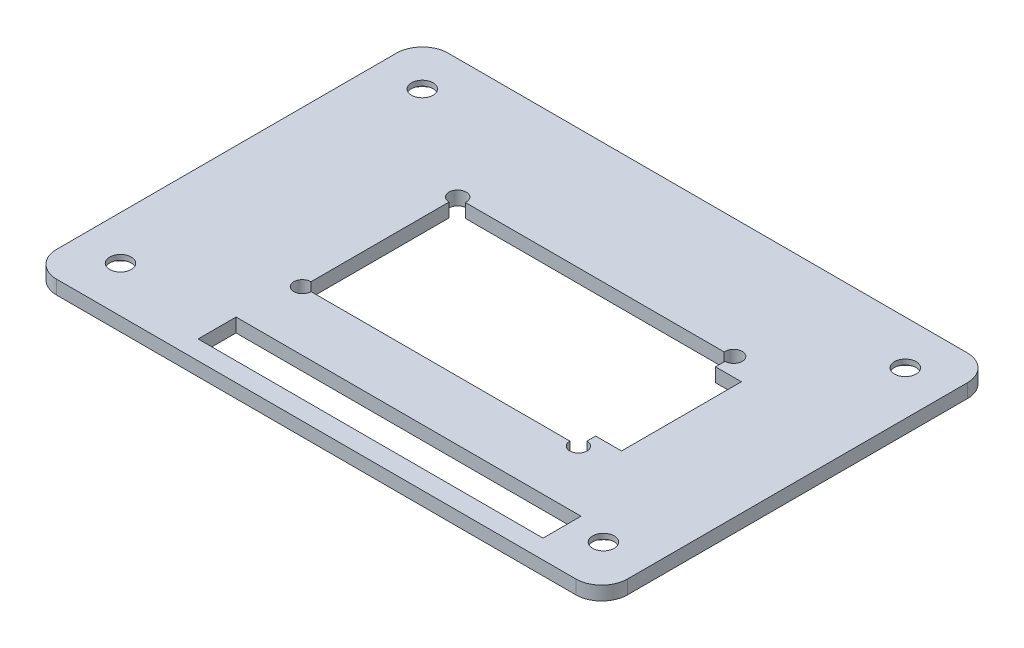
ISO-10303-21;
HEADER;
FILE_DESCRIPTION(('STEP AP214'),'2;1');
FILE_NAME('part.step','',(''),(''),'','','');
FILE_SCHEMA(('AUTOMOTIVE_DESIGN { 1 0 10303 214 1 1 1 1 }'));
ENDSEC;
DATA;
#1=APPLICATION_CONTEXT('core data for automotive mechanical design processes');
#2=APPLICATION_PROTOCOL_DEFINITION('international standard','automotive_design',2000,#1);
#3=PRODUCT_CONTEXT('',#1,'mechanical');
#4=PRODUCT('Part','Part','',(#3));
#5=PRODUCT_RELATED_PRODUCT_CATEGORY('part','',(#4));
#6=PRODUCT_DEFINITION_FORMATION('','',#4);
#7=PRODUCT_DEFINITION_CONTEXT('part definition',#1,'design');
#8=PRODUCT_DEFINITION('design','',#6,#7);
#9=PRODUCT_DEFINITION_SHAPE('','',#8);
#10=(LENGTH_UNIT() NAMED_UNIT(*) SI_UNIT(.MILLI.,.METRE.));
#11=(NAMED_UNIT(*) PLANE_ANGLE_UNIT() SI_UNIT($,.RADIAN.));
#12=(NAMED_UNIT(*) SI_UNIT($,.STERADIAN.) SOLID_ANGLE_UNIT());
#13=UNCERTAINTY_MEASURE_WITH_UNIT(LENGTH_MEASURE(1.E-05),#10,'distance_accuracy_value','');
#14=(GEOMETRIC_REPRESENTATION_CONTEXT(3) GLOBAL_UNCERTAINTY_ASSIGNED_CONTEXT((#13)) GLOBAL_UNIT_ASSIGNED_CONTEXT((#10,
#11,#12)) REPRESENTATION_CONTEXT('',''));
#15=CARTESIAN_POINT('',(0.,0.,0.));
#16=DIRECTION('',(0.,0.,1.));
#17=DIRECTION('',(1.,0.,0.));
#18=AXIS2_PLACEMENT_3D('',#15,#16,#17);
#19=CARTESIAN_POINT('',(30.1,1.6,-19.7));
#20=DIRECTION('',(0.,-1.,0.));
#21=DIRECTION('',(0.,0.,-1.));
#22=AXIS2_PLACEMENT_3D('',#19,#20,#21);
#23=CYLINDRICAL_SURFACE('',#22,3.);
#24=CARTESIAN_POINT('',(30.1,0.,-19.7));
#25=DIRECTION('',(0.,1.,0.));
#26=DIRECTION('',(0.,0.,-1.));
#27=AXIS2_PLACEMENT_3D('',#24,#25,#26);
#28=CIRCLE('',#27,3.);
#29=CARTESIAN_POINT('',(33.1,0.,-19.7));
#30=VERTEX_POINT('',#29);
#31=CARTESIAN_POINT('',(30.1,0.,-22.7));
#32=VERTEX_POINT('',#31);
#33=EDGE_CURVE('E351',#30,#32,#28,.T.);
#34=ORIENTED_EDGE('',*,*,#33,.T.);
#35=DIRECTION('',(0.,-1.,0.));
#36=VECTOR('',#35,1.);
#37=CARTESIAN_POINT('',(30.1,1.6,-22.7));
#38=LINE('',#37,#36);
#39=CARTESIAN_POINT('',(30.1,1.6,-22.7));
#40=VERTEX_POINT('',#39);
#41=EDGE_CURVE('E11',#40,#32,#38,.T.);
#42=ORIENTED_EDGE('',*,*,#41,.F.);
#43=CARTESIAN_POINT('',(30.1,1.6,-19.7));
#44=DIRECTION('',(0.,1.,0.));
#45=DIRECTION('',(0.,0.,-1.));
#46=AXIS2_PLACEMENT_3D('',#43,#44,#45);
#47=CIRCLE('',#46,3.);
#48=CARTESIAN_POINT('',(33.1,1.6,-19.7));
#49=VERTEX_POINT('',#48);
#50=EDGE_CURVE('E354',#49,#40,#47,.T.);
#51=ORIENTED_EDGE('',*,*,#50,.F.);
#52=DIRECTION('',(0.,-1.,0.));
#53=VECTOR('',#52,1.);
#54=CARTESIAN_POINT('',(33.1,1.6,-19.7));
#55=LINE('',#54,#53);
#56=EDGE_CURVE('E372',#49,#30,#55,.T.);
#57=ORIENTED_EDGE('',*,*,#56,.T.);
#58=EDGE_LOOP('',(#34,#42,#51,#57));
#59=FACE_BOUND('',#58,.T.);
#60=ADVANCED_FACE('F33',(#59),#23,.T.);
#61=CARTESIAN_POINT('',(-30.1,1.6,-22.7));
#62=DIRECTION('',(0.,0.,1.));
#63=DIRECTION('',(1.,0.,0.));
#64=AXIS2_PLACEMENT_3D('',#61,#62,#63);
#65=PLANE('',#64);
#66=DIRECTION('',(-1.,0.,0.));
#67=VECTOR('',#66,1.);
#68=CARTESIAN_POINT('',(-30.1,0.,-22.7));
#69=LINE('',#68,#67);
#70=CARTESIAN_POINT('',(-30.1,0.,-22.7));
#71=VERTEX_POINT('',#70);
#72=EDGE_CURVE('E375',#32,#71,#69,.T.);
#73=ORIENTED_EDGE('',*,*,#72,.T.);
#74=DIRECTION('',(0.,-1.,0.));
#75=VECTOR('',#74,1.);
#76=CARTESIAN_POINT('',(-30.1,1.6,-22.7));
#77=LINE('',#76,#75);
#78=CARTESIAN_POINT('',(-30.1,1.6,-22.7));
#79=VERTEX_POINT('',#78);
#80=EDGE_CURVE('E40',#79,#71,#77,.T.);
#81=ORIENTED_EDGE('',*,*,#80,.F.);
#82=DIRECTION('',(-1.,0.,0.));
#83=VECTOR('',#82,1.);
#84=CARTESIAN_POINT('',(-30.1,1.6,-22.7));
#85=LINE('',#84,#83);
#86=EDGE_CURVE('E357',#40,#79,#85,.T.);
#87=ORIENTED_EDGE('',*,*,#86,.F.);
#88=ORIENTED_EDGE('',*,*,#41,.T.);
#89=EDGE_LOOP('',(#73,#81,#87,#88));
#90=FACE_BOUND('',#89,.T.);
#91=ADVANCED_FACE('F431',(#90),#65,.F.);
#92=CARTESIAN_POINT('',(-30.1,1.6,-19.7));
#93=DIRECTION('',(0.,-1.,0.));
#94=DIRECTION('',(0.,0.,-1.));
#95=AXIS2_PLACEMENT_3D('',#92,#93,#94);
#96=CYLINDRICAL_SURFACE('',#95,3.);
#97=CARTESIAN_POINT('',(-30.1,0.,-19.7));
#98=DIRECTION('',(0.,1.,0.));
#99=DIRECTION('',(0.,0.,-1.));
#100=AXIS2_PLACEMENT_3D('',#97,#98,#99);
#101=CIRCLE('',#100,3.);
#102=CARTESIAN_POINT('',(-33.1,0.,-19.7));
#103=VERTEX_POINT('',#102);
#104=EDGE_CURVE('E377',#71,#103,#101,.T.);
#105=ORIENTED_EDGE('',*,*,#104,.T.);
#106=DIRECTION('',(0.,-1.,0.));
#107=VECTOR('',#106,1.);
#108=CARTESIAN_POINT('',(-33.1,1.6,-19.7));
#109=LINE('',#108,#107);
#110=CARTESIAN_POINT('',(-33.1,1.6,-19.7));
#111=VERTEX_POINT('',#110);
#112=EDGE_CURVE('E402',#111,#103,#109,.T.);
#113=ORIENTED_EDGE('',*,*,#112,.F.);
#114=CARTESIAN_POINT('',(-30.1,1.6,-19.7));
#115=DIRECTION('',(0.,1.,0.));
#116=DIRECTION('',(0.,0.,-1.));
#117=AXIS2_PLACEMENT_3D('',#114,#115,#116);
#118=CIRCLE('',#117,3.);
#119=EDGE_CURVE('E360',#79,#111,#118,.T.);
#120=ORIENTED_EDGE('',*,*,#119,.F.);
#121=ORIENTED_EDGE('',*,*,#80,.T.);
#122=EDGE_LOOP('',(#105,#113,#120,#121));
#123=FACE_BOUND('',#122,.T.);
#124=ADVANCED_FACE('F409',(#123),#96,.T.);
#125=CARTESIAN_POINT('',(-33.1,1.6,19.7));
#126=DIRECTION('',(1.,0.,0.));
#127=DIRECTION('',(0.,0.,-1.));
#128=AXIS2_PLACEMENT_3D('',#125,#126,#127);
#129=PLANE('',#128);
#130=DIRECTION('',(0.,0.,1.));
#131=VECTOR('',#130,1.);
#132=CARTESIAN_POINT('',(-33.1,0.,19.7));
#133=LINE('',#132,#131);
#134=CARTESIAN_POINT('',(-33.1,0.,19.7));
#135=VERTEX_POINT('',#134);
#136=EDGE_CURVE('E379',#103,#135,#133,.T.);
#137=ORIENTED_EDGE('',*,*,#136,.T.);
#138=DIRECTION('',(0.,-1.,0.));
#139=VECTOR('',#138,1.);
#140=CARTESIAN_POINT('',(-33.1,1.6,19.7));
#141=LINE('',#140,#139);
#142=CARTESIAN_POINT('',(-33.1,1.6,19.7));
#143=VERTEX_POINT('',#142);
#144=EDGE_CURVE('E399',#143,#135,#141,.T.);
#145=ORIENTED_EDGE('',*,*,#144,.F.);
#146=DIRECTION('',(0.,0.,1.));
#147=VECTOR('',#146,1.);
#148=CARTESIAN_POINT('',(-33.1,1.6,19.7));
#149=LINE('',#148,#147);
#150=EDGE_CURVE('E362',#111,#143,#149,.T.);
#151=ORIENTED_EDGE('',*,*,#150,.F.);
#152=ORIENTED_EDGE('',*,*,#112,.T.);
#153=EDGE_LOOP('',(#137,#145,#151,#152));
#154=FACE_BOUND('',#153,.T.);
#155=ADVANCED_FACE('F420',(#154),#129,.F.);
#156=CARTESIAN_POINT('',(-30.1,1.6,19.7));
#157=DIRECTION('',(0.,-1.,0.));
#158=DIRECTION('',(0.,0.,-1.));
#159=AXIS2_PLACEMENT_3D('',#156,#157,#158);
#160=CYLINDRICAL_SURFACE('',#159,3.);
#161=CARTESIAN_POINT('',(-30.1,0.,19.7));
#162=DIRECTION('',(0.,1.,0.));
#163=DIRECTION('',(0.,0.,-1.));
#164=AXIS2_PLACEMENT_3D('',#161,#162,#163);
#165=CIRCLE('',#164,3.);
#166=CARTESIAN_POINT('',(-30.1,0.,22.7));
#167=VERTEX_POINT('',#166);
#168=EDGE_CURVE('E381',#135,#167,#165,.T.);
#169=ORIENTED_EDGE('',*,*,#168,.T.);
#170=DIRECTION('',(0.,-1.,0.));
#171=VECTOR('',#170,1.);
#172=CARTESIAN_POINT('',(-30.1,1.6,22.7));
#173=LINE('',#172,#171);
#174=CARTESIAN_POINT('',(-30.1,1.6,22.7));
#175=VERTEX_POINT('',#174);
#176=EDGE_CURVE('E396',#175,#167,#173,.T.);
#177=ORIENTED_EDGE('',*,*,#176,.F.);
#178=CARTESIAN_POINT('',(-30.1,1.6,19.7));
#179=DIRECTION('',(0.,1.,0.));
#180=DIRECTION('',(0.,0.,-1.));
#181=AXIS2_PLACEMENT_3D('',#178,#179,#180);
#182=CIRCLE('',#181,3.);
#183=EDGE_CURVE('E364',#143,#175,#182,.T.);
#184=ORIENTED_EDGE('',*,*,#183,.F.);
#185=ORIENTED_EDGE('',*,*,#144,.T.);
#186=EDGE_LOOP('',(#169,#177,#184,#185));
#187=FACE_BOUND('',#186,.T.);
#188=ADVANCED_FACE('F424',(#187),#160,.T.);
#189=CARTESIAN_POINT('',(-30.1,1.6,22.7));
#190=DIRECTION('',(0.,0.,-1.));
#191=DIRECTION('',(-1.,0.,0.));
#192=AXIS2_PLACEMENT_3D('',#189,#190,#191);
#193=PLANE('',#192);
#194=DIRECTION('',(1.,0.,0.));
#195=VECTOR('',#194,1.);
#196=CARTESIAN_POINT('',(-30.1,0.,22.7));
#197=LINE('',#196,#195);
#198=CARTESIAN_POINT('',(30.1,0.,22.7));
#199=VERTEX_POINT('',#198);
#200=EDGE_CURVE('E383',#167,#199,#197,.T.);
#201=ORIENTED_EDGE('',*,*,#200,.T.);
#202=DIRECTION('',(0.,-1.,0.));
#203=VECTOR('',#202,1.);
#204=CARTESIAN_POINT('',(30.1,1.6,22.7));
#205=LINE('',#204,#203);
#206=CARTESIAN_POINT('',(30.1,1.6,22.7));
#207=VERTEX_POINT('',#206);
#208=EDGE_CURVE('E393',#207,#199,#205,.T.);
#209=ORIENTED_EDGE('',*,*,#208,.F.);
#210=DIRECTION('',(1.,0.,0.));
#211=VECTOR('',#210,1.);
#212=CARTESIAN_POINT('',(-30.1,1.6,22.7));
#213=LINE('',#212,#211);
#214=EDGE_CURVE('E366',#175,#207,#213,.T.);
#215=ORIENTED_EDGE('',*,*,#214,.F.);
#216=ORIENTED_EDGE('',*,*,#176,.T.);
#217=EDGE_LOOP('',(#201,#209,#215,#216));
#218=FACE_BOUND('',#217,.T.);
#219=ADVANCED_FACE('F444',(#218),#193,.F.);
#220=CARTESIAN_POINT('',(30.1,1.6,19.7));
#221=DIRECTION('',(0.,-1.,0.));
#222=DIRECTION('',(0.,0.,-1.));
#223=AXIS2_PLACEMENT_3D('',#220,#221,#222);
#224=CYLINDRICAL_SURFACE('',#223,3.);
#225=CARTESIAN_POINT('',(30.1,0.,19.7));
#226=DIRECTION('',(0.,1.,0.));
#227=DIRECTION('',(0.,0.,1.));
#228=AXIS2_PLACEMENT_3D('',#225,#226,#227);
#229=CIRCLE('',#228,3.);
#230=CARTESIAN_POINT('',(33.1,0.,19.7));
#231=VERTEX_POINT('',#230);
#232=EDGE_CURVE('E385',#199,#231,#229,.T.);
#233=ORIENTED_EDGE('',*,*,#232,.T.);
#234=DIRECTION('',(0.,-1.,0.));
#235=VECTOR('',#234,1.);
#236=CARTESIAN_POINT('',(33.1,1.6,19.7));
#237=LINE('',#236,#235);
#238=CARTESIAN_POINT('',(33.1,1.6,19.7));
#239=VERTEX_POINT('',#238);
#240=EDGE_CURVE('E390',#239,#231,#237,.T.);
#241=ORIENTED_EDGE('',*,*,#240,.F.);
#242=CARTESIAN_POINT('',(30.1,1.6,19.7));
#243=DIRECTION('',(0.,1.,0.));
#244=DIRECTION('',(0.,0.,1.));
#245=AXIS2_PLACEMENT_3D('',#242,#243,#244);
#246=CIRCLE('',#245,3.);
#247=EDGE_CURVE('E368',#207,#239,#246,.T.);
#248=ORIENTED_EDGE('',*,*,#247,.F.);
#249=ORIENTED_EDGE('',*,*,#208,.T.);
#250=EDGE_LOOP('',(#233,#241,#248,#249));
#251=FACE_BOUND('',#250,.T.);
#252=ADVANCED_FACE('F442',(#251),#224,.T.);
#253=CARTESIAN_POINT('',(33.1,1.6,19.7));
#254=DIRECTION('',(-1.,0.,0.));
#255=DIRECTION('',(0.,0.,1.));
#256=AXIS2_PLACEMENT_3D('',#253,#254,#255);
#257=PLANE('',#256);
#258=DIRECTION('',(0.,0.,-1.));
#259=VECTOR('',#258,1.);
#260=CARTESIAN_POINT('',(33.1,0.,19.7));
#261=LINE('',#260,#259);
#262=EDGE_CURVE('E358',#231,#30,#261,.T.);
#263=ORIENTED_EDGE('',*,*,#262,.T.);
#264=ORIENTED_EDGE('',*,*,#56,.F.);
#265=DIRECTION('',(0.,0.,-1.));
#266=VECTOR('',#265,1.);
#267=CARTESIAN_POINT('',(33.1,1.6,19.7));
#268=LINE('',#267,#266);
#269=EDGE_CURVE('E370',#239,#49,#268,.T.);
#270=ORIENTED_EDGE('',*,*,#269,.F.);
#271=ORIENTED_EDGE('',*,*,#240,.T.);
#272=EDGE_LOOP('',(#263,#264,#270,#271));
#273=FACE_BOUND('',#272,.T.);
#274=ADVANCED_FACE('F437',(#273),#257,.F.);
#275=CARTESIAN_POINT('',(30.1,1.6,-19.7));
#276=DIRECTION('',(0.,-1.,0.));
#277=DIRECTION('',(0.,0.,-1.));
#278=AXIS2_PLACEMENT_3D('',#275,#276,#277);
#279=PLANE('',#278);
#280=DIRECTION('',(0.,0.,-1.));
#281=VECTOR('',#280,1.);
#282=CARTESIAN_POINT('',(16.9000000629711,1.6,7.19999999999638));
#283=LINE('',#282,#281);
#284=CARTESIAN_POINT('',(16.9000000629711,1.6,8.20001256265664));
#285=VERTEX_POINT('',#284);
#286=CARTESIAN_POINT('',(16.9000000629711,1.6,7.19999999999638));
#287=VERTEX_POINT('',#286);
#288=EDGE_CURVE('E218',#285,#287,#283,.T.);
#289=ORIENTED_EDGE('',*,*,#288,.F.);
#290=CARTESIAN_POINT('',(16.9050125628909,1.6,9.20000000000001));
#291=DIRECTION('',(0.,-1.,0.));
#292=DIRECTION('',(0.,0.,-1.));
#293=AXIS2_PLACEMENT_3D('',#290,#291,#292);
#294=CIRCLE('',#293,1.);
#295=CARTESIAN_POINT('',(15.9050125628909,1.6,9.19999999999638));
#296=VERTEX_POINT('',#295);
#297=EDGE_CURVE('E197',#296,#285,#294,.F.);
#298=ORIENTED_EDGE('',*,*,#297,.F.);
#299=DIRECTION('',(1.,0.,-1.20427511666122E-13));
#300=VECTOR('',#299,1.);
#301=CARTESIAN_POINT('',(15.9050125628909,1.6,9.19999999999638));
#302=LINE('',#301,#300);
#303=CARTESIAN_POINT('',(-14.1,1.6,9.19999999999999));
#304=VERTEX_POINT('',#303);
#305=EDGE_CURVE('E208',#304,#296,#302,.T.);
#306=ORIENTED_EDGE('',*,*,#305,.F.);
#307=CARTESIAN_POINT('',(-15.1,1.6,9.19999999999999));
#308=DIRECTION('',(0.,-1.,0.));
#309=DIRECTION('',(0.,0.,-1.));
#310=AXIS2_PLACEMENT_3D('',#307,#308,#309);
#311=CIRCLE('',#310,0.999999999999999);
#312=CARTESIAN_POINT('',(-15.1,1.6,8.2));
#313=VERTEX_POINT('',#312);
#314=EDGE_CURVE('E47',#313,#304,#311,.F.);
#315=ORIENTED_EDGE('',*,*,#314,.F.);
#316=DIRECTION('',(0.,0.,1.));
#317=VECTOR('',#316,1.);
#318=CARTESIAN_POINT('',(-15.1,1.6,-7.8));
#319=LINE('',#318,#317);
#320=CARTESIAN_POINT('',(-15.1,1.6,-7.80000000000001));
#321=VERTEX_POINT('',#320);
#322=EDGE_CURVE('E786',#321,#313,#319,.T.);
#323=ORIENTED_EDGE('',*,*,#322,.F.);
#324=CARTESIAN_POINT('',(-15.1,1.6,-8.8));
#325=DIRECTION('',(0.,-1.,0.));
#326=DIRECTION('',(0.,0.,-1.));
#327=AXIS2_PLACEMENT_3D('',#324,#325,#326);
#328=CIRCLE('',#327,0.999999999999997);
#329=CARTESIAN_POINT('',(-14.1050125628934,1.6,-8.7));
#330=VERTEX_POINT('',#329);
#331=EDGE_CURVE('E789',#330,#321,#328,.F.);
#332=ORIENTED_EDGE('',*,*,#331,.F.);
#333=DIRECTION('',(-1.,0.,0.));
#334=VECTOR('',#333,1.);
#335=CARTESIAN_POINT('',(15.9050125628909,1.6,-8.7));
#336=LINE('',#335,#334);
#337=CARTESIAN_POINT('',(15.9050125628909,1.6,-8.7));
#338=VERTEX_POINT('',#337);
#339=EDGE_CURVE('E794',#338,#330,#336,.T.);
#340=ORIENTED_EDGE('',*,*,#339,.F.);
#341=CARTESIAN_POINT('',(16.9,1.6,-8.79999999997577));
#342=DIRECTION('',(0.,-1.,0.));
#343=DIRECTION('',(0.,0.,-1.));
#344=AXIS2_PLACEMENT_3D('',#341,#342,#343);
#345=CIRCLE('',#344,1.);
#346=CARTESIAN_POINT('',(16.9000000629711,1.6,-7.79999999997577));
#347=VERTEX_POINT('',#346);
#348=EDGE_CURVE('E797',#347,#338,#345,.F.);
#349=ORIENTED_EDGE('',*,*,#348,.F.);
#350=DIRECTION('',(0.,0.,-1.));
#351=VECTOR('',#350,1.);
#352=CARTESIAN_POINT('',(16.9000000629711,1.6,-7.79999999997577));
#353=LINE('',#352,#351);
#354=CARTESIAN_POINT('',(16.9000000629711,1.6,-6.7));
#355=VERTEX_POINT('',#354);
#356=EDGE_CURVE('E800',#355,#347,#353,.T.);
#357=ORIENTED_EDGE('',*,*,#356,.F.);
#358=DIRECTION('',(-1.,0.,0.));
#359=VECTOR('',#358,1.);
#360=CARTESIAN_POINT('',(16.9000000629711,1.6,-6.7));
#361=LINE('',#360,#359);
#362=CARTESIAN_POINT('',(19.9000000629711,1.6,-6.7));
#363=VERTEX_POINT('',#362);
#364=EDGE_CURVE('E803',#363,#355,#361,.T.);
#365=ORIENTED_EDGE('',*,*,#364,.F.);
#366=DIRECTION('',(0.,0.,-1.));
#367=VECTOR('',#366,1.);
#368=CARTESIAN_POINT('',(19.9000000629711,1.6,7.19999999999638));
#369=LINE('',#368,#367);
#370=CARTESIAN_POINT('',(19.9000000629711,1.6,7.19999999999638));
#371=VERTEX_POINT('',#370);
#372=EDGE_CURVE('E806',#371,#363,#369,.T.);
#373=ORIENTED_EDGE('',*,*,#372,.F.);
#374=DIRECTION('',(1.,0.,0.));
#375=VECTOR('',#374,1.);
#376=CARTESIAN_POINT('',(16.9000000629711,1.6,7.19999999999638));
#377=LINE('',#376,#375);
#378=EDGE_CURVE('E222',#287,#371,#377,.T.);
#379=ORIENTED_EDGE('',*,*,#378,.F.);
#380=EDGE_LOOP('',(#289,#298,#306,#315,#323,#332,#340,#349,#357,#365,#373,#379));
#381=FACE_BOUND('',#380,.T.);
#382=DIRECTION('',(1.,0.,0.));
#383=VECTOR('',#382,1.);
#384=CARTESIAN_POINT('',(-15.9,1.6,20.5));
#385=LINE('',#384,#383);
#386=CARTESIAN_POINT('',(-15.9,1.6,20.5));
#387=VERTEX_POINT('',#386);
#388=CARTESIAN_POINT('',(24.1,1.6,20.5));
#389=VERTEX_POINT('',#388);
#390=EDGE_CURVE('E277',#387,#389,#385,.T.);
#391=ORIENTED_EDGE('',*,*,#390,.F.);
#392=DIRECTION('',(0.,0.,1.));
#393=VECTOR('',#392,1.);
#394=CARTESIAN_POINT('',(-15.9,1.6,20.5));
#395=LINE('',#394,#393);
#396=CARTESIAN_POINT('',(-15.9,1.6,16.1));
#397=VERTEX_POINT('',#396);
#398=EDGE_CURVE('E280',#397,#387,#395,.T.);
#399=ORIENTED_EDGE('',*,*,#398,.F.);
#400=DIRECTION('',(-1.,0.,0.));
#401=VECTOR('',#400,1.);
#402=CARTESIAN_POINT('',(-15.9,1.6,16.1));
#403=LINE('',#402,#401);
#404=CARTESIAN_POINT('',(24.1,1.6,16.1));
#405=VERTEX_POINT('',#404);
#406=EDGE_CURVE('E297',#405,#397,#403,.T.);
#407=ORIENTED_EDGE('',*,*,#406,.F.);
#408=DIRECTION('',(0.,0.,-1.));
#409=VECTOR('',#408,1.);
#410=CARTESIAN_POINT('',(24.1,1.6,20.5));
#411=LINE('',#410,#409);
#412=EDGE_CURVE('E55',#389,#405,#411,.T.);
#413=ORIENTED_EDGE('',*,*,#412,.F.);
#414=EDGE_LOOP('',(#391,#399,#407,#413));
#415=FACE_BOUND('',#414,.T.);
#416=CARTESIAN_POINT('',(-28.0000000000001,1.6,17.4));
#417=DIRECTION('',(0.,-1.,0.));
#418=DIRECTION('',(0.,0.,-1.));
#419=AXIS2_PLACEMENT_3D('',#416,#417,#418);
#420=CIRCLE('',#419,1.25);
#421=CARTESIAN_POINT('',(-28.0000000000001,1.6,16.15));
#422=VERTEX_POINT('',#421);
#423=EDGE_CURVE('E317',#422,#422,#420,.F.);
#424=ORIENTED_EDGE('',*,*,#423,.F.);
#425=EDGE_LOOP('',(#424));
#426=FACE_BOUND('',#425,.T.);
#427=CARTESIAN_POINT('',(27.9999999999999,1.6,17.4));
#428=DIRECTION('',(0.,-1.,0.));
#429=DIRECTION('',(0.,0.,-1.));
#430=AXIS2_PLACEMENT_3D('',#427,#428,#429);
#431=CIRCLE('',#430,1.25);
#432=CARTESIAN_POINT('',(27.9999999999999,1.6,16.15));
#433=VERTEX_POINT('',#432);
#434=EDGE_CURVE('E310',#433,#433,#431,.F.);
#435=ORIENTED_EDGE('',*,*,#434,.F.);
#436=EDGE_LOOP('',(#435));
#437=FACE_BOUND('',#436,.T.);
#438=CARTESIAN_POINT('',(28.,1.6,-17.6));
#439=DIRECTION('',(0.,-1.,0.));
#440=DIRECTION('',(0.,0.,-1.));
#441=AXIS2_PLACEMENT_3D('',#438,#439,#440);
#442=CIRCLE('',#441,1.25);
#443=CARTESIAN_POINT('',(28.,1.6,-18.85));
#444=VERTEX_POINT('',#443);
#445=EDGE_CURVE('E309',#444,#444,#442,.F.);
#446=ORIENTED_EDGE('',*,*,#445,.F.);
#447=EDGE_LOOP('',(#446));
#448=FACE_BOUND('',#447,.T.);
#449=CARTESIAN_POINT('',(-28.,1.6,-17.6));
#450=DIRECTION('',(0.,-1.,0.));
#451=DIRECTION('',(0.,0.,-1.));
#452=AXIS2_PLACEMENT_3D('',#449,#450,#451);
#453=CIRCLE('',#452,1.25);
#454=CARTESIAN_POINT('',(-28.,1.6,-18.85));
#455=VERTEX_POINT('',#454);
#456=EDGE_CURVE('E326',#455,#455,#453,.F.);
#457=ORIENTED_EDGE('',*,*,#456,.F.);
#458=EDGE_LOOP('',(#457));
#459=FACE_BOUND('',#458,.T.);
#460=ORIENTED_EDGE('',*,*,#50,.T.);
#461=ORIENTED_EDGE('',*,*,#86,.T.);
#462=ORIENTED_EDGE('',*,*,#119,.T.);
#463=ORIENTED_EDGE('',*,*,#150,.T.);
#464=ORIENTED_EDGE('',*,*,#183,.T.);
#465=ORIENTED_EDGE('',*,*,#214,.T.);
#466=ORIENTED_EDGE('',*,*,#247,.T.);
#467=ORIENTED_EDGE('',*,*,#269,.T.);
#468=EDGE_LOOP('',(#460,#461,#462,#463,#464,#465,#466,#467));
#469=FACE_BOUND('',#468,.T.);
#470=ADVANCED_FACE('F214',(#381,#415,#426,#437,#448,#459,#469),#279,.F.);
#471=CARTESIAN_POINT('',(30.1,0.,-19.7));
#472=DIRECTION('',(0.,-1.,0.));
#473=DIRECTION('',(0.,0.,-1.));
#474=AXIS2_PLACEMENT_3D('',#471,#472,#473);
#475=PLANE('',#474);
#476=CARTESIAN_POINT('',(16.9050125628909,0.,9.20000000000001));
#477=DIRECTION('',(0.,-1.,0.));
#478=DIRECTION('',(0.,0.,-1.));
#479=AXIS2_PLACEMENT_3D('',#476,#477,#478);
#480=CIRCLE('',#479,1.);
#481=CARTESIAN_POINT('',(16.9000000629711,0.,8.20001256265664));
#482=VERTEX_POINT('',#481);
#483=CARTESIAN_POINT('',(15.9050125628909,0.,9.19999999999638));
#484=VERTEX_POINT('',#483);
#485=EDGE_CURVE('E200',#482,#484,#480,.T.);
#486=ORIENTED_EDGE('',*,*,#485,.F.);
#487=DIRECTION('',(0.,0.,1.));
#488=VECTOR('',#487,1.);
#489=CARTESIAN_POINT('',(16.9000000629711,0.,7.19999999999638));
#490=LINE('',#489,#488);
#491=CARTESIAN_POINT('',(16.9000000629711,0.,7.19999999999638));
#492=VERTEX_POINT('',#491);
#493=EDGE_CURVE('E205',#492,#482,#490,.T.);
#494=ORIENTED_EDGE('',*,*,#493,.F.);
#495=DIRECTION('',(-1.,0.,0.));
#496=VECTOR('',#495,1.);
#497=CARTESIAN_POINT('',(16.9000000629711,0.,7.19999999999638));
#498=LINE('',#497,#496);
#499=CARTESIAN_POINT('',(19.9000000629711,0.,7.19999999999638));
#500=VERTEX_POINT('',#499);
#501=EDGE_CURVE('E251',#500,#492,#498,.T.);
#502=ORIENTED_EDGE('',*,*,#501,.F.);
#503=DIRECTION('',(0.,0.,1.));
#504=VECTOR('',#503,1.);
#505=CARTESIAN_POINT('',(19.9000000629711,0.,7.19999999999638));
#506=LINE('',#505,#504);
#507=CARTESIAN_POINT('',(19.9000000629711,0.,-6.7));
#508=VERTEX_POINT('',#507);
#509=EDGE_CURVE('E248',#508,#500,#506,.T.);
#510=ORIENTED_EDGE('',*,*,#509,.F.);
#511=DIRECTION('',(1.,0.,0.));
#512=VECTOR('',#511,1.);
#513=CARTESIAN_POINT('',(16.9000000629711,0.,-6.7));
#514=LINE('',#513,#512);
#515=CARTESIAN_POINT('',(16.9000000629711,0.,-6.7));
#516=VERTEX_POINT('',#515);
#517=EDGE_CURVE('E245',#516,#508,#514,.T.);
#518=ORIENTED_EDGE('',*,*,#517,.F.);
#519=DIRECTION('',(0.,0.,1.));
#520=VECTOR('',#519,1.);
#521=CARTESIAN_POINT('',(16.9000000629711,0.,-7.79999999997577));
#522=LINE('',#521,#520);
#523=CARTESIAN_POINT('',(16.9000000629711,0.,-7.79999999997577));
#524=VERTEX_POINT('',#523);
#525=EDGE_CURVE('E242',#524,#516,#522,.T.);
#526=ORIENTED_EDGE('',*,*,#525,.F.);
#527=CARTESIAN_POINT('',(16.9,0.,-8.79999999997577));
#528=DIRECTION('',(0.,-1.,0.));
#529=DIRECTION('',(0.,0.,-1.));
#530=AXIS2_PLACEMENT_3D('',#527,#528,#529);
#531=CIRCLE('',#530,1.);
#532=CARTESIAN_POINT('',(15.9050125628909,0.,-8.7));
#533=VERTEX_POINT('',#532);
#534=EDGE_CURVE('E239',#533,#524,#531,.T.);
#535=ORIENTED_EDGE('',*,*,#534,.F.);
#536=DIRECTION('',(1.,0.,0.));
#537=VECTOR('',#536,1.);
#538=CARTESIAN_POINT('',(15.9050125628909,0.,-8.7));
#539=LINE('',#538,#537);
#540=CARTESIAN_POINT('',(-14.1050125628934,0.,-8.7));
#541=VERTEX_POINT('',#540);
#542=EDGE_CURVE('E236',#541,#533,#539,.T.);
#543=ORIENTED_EDGE('',*,*,#542,.F.);
#544=CARTESIAN_POINT('',(-15.1,0.,-8.8));
#545=DIRECTION('',(0.,-1.,0.));
#546=DIRECTION('',(0.,0.,-1.));
#547=AXIS2_PLACEMENT_3D('',#544,#545,#546);
#548=CIRCLE('',#547,0.999999999999997);
#549=CARTESIAN_POINT('',(-15.1,0.,-7.80000000000001));
#550=VERTEX_POINT('',#549);
#551=EDGE_CURVE('E233',#550,#541,#548,.T.);
#552=ORIENTED_EDGE('',*,*,#551,.F.);
#553=DIRECTION('',(0.,0.,-1.));
#554=VECTOR('',#553,1.);
#555=CARTESIAN_POINT('',(-15.1,0.,-7.8));
#556=LINE('',#555,#554);
#557=CARTESIAN_POINT('',(-15.1,0.,8.2));
#558=VERTEX_POINT('',#557);
#559=EDGE_CURVE('E230',#558,#550,#556,.T.);
#560=ORIENTED_EDGE('',*,*,#559,.F.);
#561=CARTESIAN_POINT('',(-15.1,0.,9.19999999999999));
#562=DIRECTION('',(0.,-1.,0.));
#563=DIRECTION('',(0.,0.,-1.));
#564=AXIS2_PLACEMENT_3D('',#561,#562,#563);
#565=CIRCLE('',#564,0.999999999999999);
#566=CARTESIAN_POINT('',(-14.1,0.,9.19999999999999));
#567=VERTEX_POINT('',#566);
#568=EDGE_CURVE('E227',#567,#558,#565,.T.);
#569=ORIENTED_EDGE('',*,*,#568,.F.);
#570=DIRECTION('',(-1.,0.,1.20427511666122E-13));
#571=VECTOR('',#570,1.);
#572=CARTESIAN_POINT('',(15.9050125628909,0.,9.19999999999638));
#573=LINE('',#572,#571);
#574=EDGE_CURVE('E220',#484,#567,#573,.T.);
#575=ORIENTED_EDGE('',*,*,#574,.F.);
#576=EDGE_LOOP('',(#486,#494,#502,#510,#518,#526,#535,#543,#552,#560,#569,#575));
#577=FACE_BOUND('',#576,.T.);
#578=DIRECTION('',(0.,0.,-1.));
#579=VECTOR('',#578,1.);
#580=CARTESIAN_POINT('',(-15.9,0.,20.5));
#581=LINE('',#580,#579);
#582=CARTESIAN_POINT('',(-15.9,0.,20.5));
#583=VERTEX_POINT('',#582);
#584=CARTESIAN_POINT('',(-15.9,0.,16.1));
#585=VERTEX_POINT('',#584);
#586=EDGE_CURVE('E283',#583,#585,#581,.T.);
#587=ORIENTED_EDGE('',*,*,#586,.F.);
#588=DIRECTION('',(-1.,0.,0.));
#589=VECTOR('',#588,1.);
#590=CARTESIAN_POINT('',(-15.9,0.,20.5));
#591=LINE('',#590,#589);
#592=CARTESIAN_POINT('',(24.1,0.,20.5));
#593=VERTEX_POINT('',#592);
#594=EDGE_CURVE('E291',#593,#583,#591,.T.);
#595=ORIENTED_EDGE('',*,*,#594,.F.);
#596=DIRECTION('',(0.,0.,1.));
#597=VECTOR('',#596,1.);
#598=CARTESIAN_POINT('',(24.1,0.,20.5));
#599=LINE('',#598,#597);
#600=CARTESIAN_POINT('',(24.1,0.,16.1));
#601=VERTEX_POINT('',#600);
#602=EDGE_CURVE('E288',#601,#593,#599,.T.);
#603=ORIENTED_EDGE('',*,*,#602,.F.);
#604=DIRECTION('',(1.,0.,0.));
#605=VECTOR('',#604,1.);
#606=CARTESIAN_POINT('',(-15.9,0.,16.1));
#607=LINE('',#606,#605);
#608=EDGE_CURVE('E285',#585,#601,#607,.T.);
#609=ORIENTED_EDGE('',*,*,#608,.F.);
#610=EDGE_LOOP('',(#587,#595,#603,#609));
#611=FACE_BOUND('',#610,.T.);
#612=CARTESIAN_POINT('',(-28.0000000000001,0.,17.4));
#613=DIRECTION('',(0.,-1.,0.));
#614=DIRECTION('',(0.,0.,-1.));
#615=AXIS2_PLACEMENT_3D('',#612,#613,#614);
#616=CIRCLE('',#615,2.6);
#617=CARTESIAN_POINT('',(-28.0000000000001,0.,14.8));
#618=VERTEX_POINT('',#617);
#619=EDGE_CURVE('E329',#618,#618,#616,.T.);
#620=ORIENTED_EDGE('',*,*,#619,.F.);
#621=EDGE_LOOP('',(#620));
#622=FACE_BOUND('',#621,.T.);
#623=CARTESIAN_POINT('',(27.9999999999999,0.,17.4));
#624=DIRECTION('',(0.,-1.,0.));
#625=DIRECTION('',(0.,0.,-1.));
#626=AXIS2_PLACEMENT_3D('',#623,#624,#625);
#627=CIRCLE('',#626,2.6);
#628=CARTESIAN_POINT('',(27.9999999999999,0.,14.8));
#629=VERTEX_POINT('',#628);
#630=EDGE_CURVE('E340',#629,#629,#627,.T.);
#631=ORIENTED_EDGE('',*,*,#630,.F.);
#632=EDGE_LOOP('',(#631));
#633=FACE_BOUND('',#632,.T.);
#634=CARTESIAN_POINT('',(28.,0.,-17.6));
#635=DIRECTION('',(0.,-1.,0.));
#636=DIRECTION('',(0.,0.,-1.));
#637=AXIS2_PLACEMENT_3D('',#634,#635,#636);
#638=CIRCLE('',#637,2.6);
#639=CARTESIAN_POINT('',(28.,0.,-20.2));
#640=VERTEX_POINT('',#639);
#641=EDGE_CURVE('E334',#640,#640,#638,.T.);
#642=ORIENTED_EDGE('',*,*,#641,.F.);
#643=EDGE_LOOP('',(#642));
#644=FACE_BOUND('',#643,.T.);
#645=CARTESIAN_POINT('',(-28.,0.,-17.6));
#646=DIRECTION('',(0.,-1.,0.));
#647=DIRECTION('',(0.,0.,-1.));
#648=AXIS2_PLACEMENT_3D('',#645,#646,#647);
#649=CIRCLE('',#648,2.6);
#650=CARTESIAN_POINT('',(-28.,0.,-20.2));
#651=VERTEX_POINT('',#650);
#652=EDGE_CURVE('E333',#651,#651,#649,.T.);
#653=ORIENTED_EDGE('',*,*,#652,.F.);
#654=EDGE_LOOP('',(#653));
#655=FACE_BOUND('',#654,.T.);
#656=ORIENTED_EDGE('',*,*,#33,.F.);
#657=ORIENTED_EDGE('',*,*,#262,.F.);
#658=ORIENTED_EDGE('',*,*,#232,.F.);
#659=ORIENTED_EDGE('',*,*,#200,.F.);
#660=ORIENTED_EDGE('',*,*,#168,.F.);
#661=ORIENTED_EDGE('',*,*,#136,.F.);
#662=ORIENTED_EDGE('',*,*,#104,.F.);
#663=ORIENTED_EDGE('',*,*,#72,.F.);
#664=EDGE_LOOP('',(#656,#657,#658,#659,#660,#661,#662,#663));
#665=FACE_BOUND('',#664,.T.);
#666=ADVANCED_FACE('F415',(#577,#611,#622,#633,#644,#655,#665),#475,.T.);
#667=CARTESIAN_POINT('',(-28.,1.,-17.6));
#668=DIRECTION('',(0.,-1.,0.));
#669=DIRECTION('',(0.,0.,-1.));
#670=AXIS2_PLACEMENT_3D('',#667,#668,#669);
#671=CYLINDRICAL_SURFACE('',#670,2.6);
#672=CARTESIAN_POINT('',(-28.,1.,-17.6));
#673=DIRECTION('',(0.,-1.,0.));
#674=DIRECTION('',(0.,0.,-1.));
#675=AXIS2_PLACEMENT_3D('',#672,#673,#674);
#676=CIRCLE('',#675,2.6);
#677=CARTESIAN_POINT('',(-28.,1.,-20.2));
#678=VERTEX_POINT('',#677);
#679=EDGE_CURVE('E348',#678,#678,#676,.T.);
#680=ORIENTED_EDGE('',*,*,#679,.F.);
#681=EDGE_LOOP('',(#680));
#682=FACE_BOUND('',#681,.T.);
#683=ORIENTED_EDGE('',*,*,#652,.T.);
#684=EDGE_LOOP('',(#683));
#685=FACE_BOUND('',#684,.T.);
#686=ADVANCED_FACE('F496',(#682,#685),#671,.F.);
#687=CARTESIAN_POINT('',(-28.,1.,-17.6));
#688=DIRECTION('',(0.,-1.,0.));
#689=DIRECTION('',(0.,0.,-1.));
#690=AXIS2_PLACEMENT_3D('',#687,#688,#689);
#691=PLANE('',#690);
#692=CARTESIAN_POINT('',(-28.,1.,-17.6));
#693=DIRECTION('',(0.,-1.,0.));
#694=DIRECTION('',(0.,0.,-1.));
#695=AXIS2_PLACEMENT_3D('',#692,#693,#694);
#696=CIRCLE('',#695,1.25);
#697=CARTESIAN_POINT('',(-28.,1.,-18.85));
#698=VERTEX_POINT('',#697);
#699=EDGE_CURVE('E313',#698,#698,#696,.T.);
#700=ORIENTED_EDGE('',*,*,#699,.F.);
#701=EDGE_LOOP('',(#700));
#702=FACE_BOUND('',#701,.T.);
#703=ORIENTED_EDGE('',*,*,#679,.T.);
#704=EDGE_LOOP('',(#703));
#705=FACE_BOUND('',#704,.T.);
#706=ADVANCED_FACE('F501',(#702,#705),#691,.T.);
#707=CARTESIAN_POINT('',(28.,1.,-17.6));
#708=DIRECTION('',(0.,-1.,0.));
#709=DIRECTION('',(0.,0.,-1.));
#710=AXIS2_PLACEMENT_3D('',#707,#708,#709);
#711=CYLINDRICAL_SURFACE('',#710,2.6);
#712=CARTESIAN_POINT('',(28.,1.,-17.6));
#713=DIRECTION('',(0.,-1.,0.));
#714=DIRECTION('',(0.,0.,-1.));
#715=AXIS2_PLACEMENT_3D('',#712,#713,#714);
#716=CIRCLE('',#715,2.6);
#717=CARTESIAN_POINT('',(28.,1.,-20.2));
#718=VERTEX_POINT('',#717);
#719=EDGE_CURVE('E330',#718,#718,#716,.T.);
#720=ORIENTED_EDGE('',*,*,#719,.F.);
#721=EDGE_LOOP('',(#720));
#722=FACE_BOUND('',#721,.T.);
#723=ORIENTED_EDGE('',*,*,#641,.T.);
#724=EDGE_LOOP('',(#723));
#725=FACE_BOUND('',#724,.T.);
#726=ADVANCED_FACE('F511',(#722,#725),#711,.F.);
#727=CARTESIAN_POINT('',(28.,1.,-17.6));
#728=DIRECTION('',(0.,-1.,0.));
#729=DIRECTION('',(0.,0.,-1.));
#730=AXIS2_PLACEMENT_3D('',#727,#728,#729);
#731=PLANE('',#730);
#732=CARTESIAN_POINT('',(28.,1.,-17.6));
#733=DIRECTION('',(0.,-1.,0.));
#734=DIRECTION('',(0.,0.,-1.));
#735=AXIS2_PLACEMENT_3D('',#732,#733,#734);
#736=CIRCLE('',#735,1.25);
#737=CARTESIAN_POINT('',(28.,1.,-18.85));
#738=VERTEX_POINT('',#737);
#739=EDGE_CURVE('E306',#738,#738,#736,.T.);
#740=ORIENTED_EDGE('',*,*,#739,.F.);
#741=EDGE_LOOP('',(#740));
#742=FACE_BOUND('',#741,.T.);
#743=ORIENTED_EDGE('',*,*,#719,.T.);
#744=EDGE_LOOP('',(#743));
#745=FACE_BOUND('',#744,.T.);
#746=ADVANCED_FACE('F516',(#742,#745),#731,.T.);
#747=CARTESIAN_POINT('',(27.9999999999999,1.,17.4));
#748=DIRECTION('',(0.,-1.,0.));
#749=DIRECTION('',(0.,0.,-1.));
#750=AXIS2_PLACEMENT_3D('',#747,#748,#749);
#751=CYLINDRICAL_SURFACE('',#750,2.6);
#752=CARTESIAN_POINT('',(27.9999999999999,1.,17.4));
#753=DIRECTION('',(0.,-1.,0.));
#754=DIRECTION('',(0.,0.,-1.));
#755=AXIS2_PLACEMENT_3D('',#752,#753,#754);
#756=CIRCLE('',#755,2.6);
#757=CARTESIAN_POINT('',(27.9999999999999,1.,14.8));
#758=VERTEX_POINT('',#757);
#759=EDGE_CURVE('E337',#758,#758,#756,.T.);
#760=ORIENTED_EDGE('',*,*,#759,.F.);
#761=EDGE_LOOP('',(#760));
#762=FACE_BOUND('',#761,.T.);
#763=ORIENTED_EDGE('',*,*,#630,.T.);
#764=EDGE_LOOP('',(#763));
#765=FACE_BOUND('',#764,.T.);
#766=ADVANCED_FACE('F524',(#762,#765),#751,.F.);
#767=CARTESIAN_POINT('',(27.9999999999999,1.,17.4));
#768=DIRECTION('',(0.,-1.,0.));
#769=DIRECTION('',(0.,0.,-1.));
#770=AXIS2_PLACEMENT_3D('',#767,#768,#769);
#771=PLANE('',#770);
#772=CARTESIAN_POINT('',(27.9999999999999,1.,17.4));
#773=DIRECTION('',(0.,-1.,0.));
#774=DIRECTION('',(0.,0.,-1.));
#775=AXIS2_PLACEMENT_3D('',#772,#773,#774);
#776=CIRCLE('',#775,1.25);
#777=CARTESIAN_POINT('',(27.9999999999999,1.,16.15));
#778=VERTEX_POINT('',#777);
#779=EDGE_CURVE('E314',#778,#778,#776,.T.);
#780=ORIENTED_EDGE('',*,*,#779,.F.);
#781=EDGE_LOOP('',(#780));
#782=FACE_BOUND('',#781,.T.);
#783=ORIENTED_EDGE('',*,*,#759,.T.);
#784=EDGE_LOOP('',(#783));
#785=FACE_BOUND('',#784,.T.);
#786=ADVANCED_FACE('F529',(#782,#785),#771,.T.);
#787=CARTESIAN_POINT('',(-28.0000000000001,1.,17.4));
#788=DIRECTION('',(0.,-1.,0.));
#789=DIRECTION('',(0.,0.,-1.));
#790=AXIS2_PLACEMENT_3D('',#787,#788,#789);
#791=CYLINDRICAL_SURFACE('',#790,2.6);
#792=CARTESIAN_POINT('',(-28.0000000000001,1.,17.4));
#793=DIRECTION('',(0.,-1.,0.));
#794=DIRECTION('',(0.,0.,-1.));
#795=AXIS2_PLACEMENT_3D('',#792,#793,#794);
#796=CIRCLE('',#795,2.6);
#797=CARTESIAN_POINT('',(-28.0000000000001,1.,14.8));
#798=VERTEX_POINT('',#797);
#799=EDGE_CURVE('E343',#798,#798,#796,.T.);
#800=ORIENTED_EDGE('',*,*,#799,.F.);
#801=EDGE_LOOP('',(#800));
#802=FACE_BOUND('',#801,.T.);
#803=ORIENTED_EDGE('',*,*,#619,.T.);
#804=EDGE_LOOP('',(#803));
#805=FACE_BOUND('',#804,.T.);
#806=ADVANCED_FACE('F537',(#802,#805),#791,.F.);
#807=CARTESIAN_POINT('',(-28.0000000000001,1.,17.4));
#808=DIRECTION('',(0.,-1.,0.));
#809=DIRECTION('',(0.,0.,-1.));
#810=AXIS2_PLACEMENT_3D('',#807,#808,#809);
#811=PLANE('',#810);
#812=CARTESIAN_POINT('',(-28.0000000000001,1.,17.4));
#813=DIRECTION('',(0.,-1.,0.));
#814=DIRECTION('',(0.,0.,-1.));
#815=AXIS2_PLACEMENT_3D('',#812,#813,#814);
#816=CIRCLE('',#815,1.25);
#817=CARTESIAN_POINT('',(-28.0000000000001,1.,16.15));
#818=VERTEX_POINT('',#817);
#819=EDGE_CURVE('E211',#818,#818,#816,.T.);
#820=ORIENTED_EDGE('',*,*,#819,.F.);
#821=EDGE_LOOP('',(#820));
#822=FACE_BOUND('',#821,.T.);
#823=ORIENTED_EDGE('',*,*,#799,.T.);
#824=EDGE_LOOP('',(#823));
#825=FACE_BOUND('',#824,.T.);
#826=ADVANCED_FACE('F542',(#822,#825),#811,.T.);
#827=CARTESIAN_POINT('',(-28.,1.601,-17.6));
#828=DIRECTION('',(0.,-1.,0.));
#829=DIRECTION('',(0.,0.,-1.));
#830=AXIS2_PLACEMENT_3D('',#827,#828,#829);
#831=CYLINDRICAL_SURFACE('',#830,1.25);
#832=ORIENTED_EDGE('',*,*,#699,.T.);
#833=EDGE_LOOP('',(#832));
#834=FACE_BOUND('',#833,.T.);
#835=ORIENTED_EDGE('',*,*,#456,.T.);
#836=EDGE_LOOP('',(#835));
#837=FACE_BOUND('',#836,.T.);
#838=ADVANCED_FACE('F573',(#834,#837),#831,.F.);
#839=CARTESIAN_POINT('',(28.,1.601,-17.6));
#840=DIRECTION('',(0.,-1.,0.));
#841=DIRECTION('',(0.,0.,-1.));
#842=AXIS2_PLACEMENT_3D('',#839,#840,#841);
#843=CYLINDRICAL_SURFACE('',#842,1.25);
#844=ORIENTED_EDGE('',*,*,#739,.T.);
#845=EDGE_LOOP('',(#844));
#846=FACE_BOUND('',#845,.T.);
#847=ORIENTED_EDGE('',*,*,#445,.T.);
#848=EDGE_LOOP('',(#847));
#849=FACE_BOUND('',#848,.T.);
#850=ADVANCED_FACE('F583',(#846,#849),#843,.F.);
#851=CARTESIAN_POINT('',(27.9999999999999,1.601,17.4));
#852=DIRECTION('',(0.,-1.,0.));
#853=DIRECTION('',(0.,0.,-1.));
#854=AXIS2_PLACEMENT_3D('',#851,#852,#853);
#855=CYLINDRICAL_SURFACE('',#854,1.25);
#856=ORIENTED_EDGE('',*,*,#779,.T.);
#857=EDGE_LOOP('',(#856));
#858=FACE_BOUND('',#857,.T.);
#859=ORIENTED_EDGE('',*,*,#434,.T.);
#860=EDGE_LOOP('',(#859));
#861=FACE_BOUND('',#860,.T.);
#862=ADVANCED_FACE('F593',(#858,#861),#855,.F.);
#863=CARTESIAN_POINT('',(-28.0000000000001,1.601,17.4));
#864=DIRECTION('',(0.,-1.,0.));
#865=DIRECTION('',(0.,0.,-1.));
#866=AXIS2_PLACEMENT_3D('',#863,#864,#865);
#867=CYLINDRICAL_SURFACE('',#866,1.25);
#868=ORIENTED_EDGE('',*,*,#819,.T.);
#869=EDGE_LOOP('',(#868));
#870=FACE_BOUND('',#869,.T.);
#871=ORIENTED_EDGE('',*,*,#423,.T.);
#872=EDGE_LOOP('',(#871));
#873=FACE_BOUND('',#872,.T.);
#874=ADVANCED_FACE('F603',(#870,#873),#867,.F.);
#875=CARTESIAN_POINT('',(-15.9,1.601,20.5));
#876=DIRECTION('',(-1.,0.,0.));
#877=DIRECTION('',(0.,0.,1.));
#878=AXIS2_PLACEMENT_3D('',#875,#876,#877);
#879=PLANE('',#878);
#880=ORIENTED_EDGE('',*,*,#398,.T.);
#881=DIRECTION('',(0.,-1.,0.));
#882=VECTOR('',#881,1.);
#883=CARTESIAN_POINT('',(-15.9,1.601,20.5));
#884=LINE('',#883,#882);
#885=EDGE_CURVE('E295',#387,#583,#884,.T.);
#886=ORIENTED_EDGE('',*,*,#885,.T.);
#887=ORIENTED_EDGE('',*,*,#586,.T.);
#888=DIRECTION('',(0.,-1.,0.));
#889=VECTOR('',#888,1.);
#890=CARTESIAN_POINT('',(-15.9,1.601,16.1));
#891=LINE('',#890,#889);
#892=EDGE_CURVE('E294',#397,#585,#891,.T.);
#893=ORIENTED_EDGE('',*,*,#892,.F.);
#894=EDGE_LOOP('',(#880,#886,#887,#893));
#895=FACE_BOUND('',#894,.T.);
#896=ADVANCED_FACE('F613',(#895),#879,.F.);
#897=CARTESIAN_POINT('',(-15.9,1.601,20.5));
#898=DIRECTION('',(0.,0.,1.));
#899=DIRECTION('',(1.,0.,0.));
#900=AXIS2_PLACEMENT_3D('',#897,#898,#899);
#901=PLANE('',#900);
#902=ORIENTED_EDGE('',*,*,#390,.T.);
#903=DIRECTION('',(0.,-1.,0.));
#904=VECTOR('',#903,1.);
#905=CARTESIAN_POINT('',(24.1,1.601,20.5));
#906=LINE('',#905,#904);
#907=EDGE_CURVE('E298',#389,#593,#906,.T.);
#908=ORIENTED_EDGE('',*,*,#907,.T.);
#909=ORIENTED_EDGE('',*,*,#594,.T.);
#910=ORIENTED_EDGE('',*,*,#885,.F.);
#911=EDGE_LOOP('',(#902,#908,#909,#910));
#912=FACE_BOUND('',#911,.T.);
#913=ADVANCED_FACE('F636',(#912),#901,.F.);
#914=CARTESIAN_POINT('',(24.1,1.601,20.5));
#915=DIRECTION('',(1.,0.,0.));
#916=DIRECTION('',(0.,0.,-1.));
#917=AXIS2_PLACEMENT_3D('',#914,#915,#916);
#918=PLANE('',#917);
#919=ORIENTED_EDGE('',*,*,#412,.T.);
#920=DIRECTION('',(0.,-1.,0.));
#921=VECTOR('',#920,1.);
#922=CARTESIAN_POINT('',(24.1,1.601,16.1));
#923=LINE('',#922,#921);
#924=EDGE_CURVE('E300',#405,#601,#923,.T.);
#925=ORIENTED_EDGE('',*,*,#924,.T.);
#926=ORIENTED_EDGE('',*,*,#602,.T.);
#927=ORIENTED_EDGE('',*,*,#907,.F.);
#928=EDGE_LOOP('',(#919,#925,#926,#927));
#929=FACE_BOUND('',#928,.T.);
#930=ADVANCED_FACE('F646',(#929),#918,.F.);
#931=CARTESIAN_POINT('',(-15.9,1.601,16.1));
#932=DIRECTION('',(0.,0.,-1.));
#933=DIRECTION('',(-1.,0.,0.));
#934=AXIS2_PLACEMENT_3D('',#931,#932,#933);
#935=PLANE('',#934);
#936=ORIENTED_EDGE('',*,*,#406,.T.);
#937=ORIENTED_EDGE('',*,*,#892,.T.);
#938=ORIENTED_EDGE('',*,*,#608,.T.);
#939=ORIENTED_EDGE('',*,*,#924,.F.);
#940=EDGE_LOOP('',(#936,#937,#938,#939));
#941=FACE_BOUND('',#940,.T.);
#942=ADVANCED_FACE('F656',(#941),#935,.F.);
#943=CARTESIAN_POINT('',(16.9050125628909,1.601,9.20000000000001));
#944=DIRECTION('',(0.,-1.,0.));
#945=DIRECTION('',(0.,0.,-1.));
#946=AXIS2_PLACEMENT_3D('',#943,#944,#945);
#947=CYLINDRICAL_SURFACE('',#946,1.);
#948=ORIENTED_EDGE('',*,*,#297,.T.);
#949=DIRECTION('',(0.,-1.,0.));
#950=VECTOR('',#949,1.);
#951=CARTESIAN_POINT('',(16.9000000629711,1.601,8.20001256265664));
#952=LINE('',#951,#950);
#953=EDGE_CURVE('E212',#285,#482,#952,.T.);
#954=ORIENTED_EDGE('',*,*,#953,.T.);
#955=ORIENTED_EDGE('',*,*,#485,.T.);
#956=DIRECTION('',(0.,-1.,0.));
#957=VECTOR('',#956,1.);
#958=CARTESIAN_POINT('',(15.9050125628909,1.601,9.19999999999638));
#959=LINE('',#958,#957);
#960=EDGE_CURVE('E193',#296,#484,#959,.T.);
#961=ORIENTED_EDGE('',*,*,#960,.F.);
#962=EDGE_LOOP('',(#948,#954,#955,#961));
#963=FACE_BOUND('',#962,.T.);
#964=ADVANCED_FACE('F195',(#963),#947,.F.);
#965=CARTESIAN_POINT('',(16.9000000629711,1.601,7.19999999999638));
#966=DIRECTION('',(1.,0.,0.));
#967=DIRECTION('',(0.,0.,-1.));
#968=AXIS2_PLACEMENT_3D('',#965,#966,#967);
#969=PLANE('',#968);
#970=ORIENTED_EDGE('',*,*,#288,.T.);
#971=DIRECTION('',(0.,-1.,0.));
#972=VECTOR('',#971,1.);
#973=CARTESIAN_POINT('',(16.9000000629711,1.601,7.19999999999638));
#974=LINE('',#973,#972);
#975=EDGE_CURVE('E257',#287,#492,#974,.T.);
#976=ORIENTED_EDGE('',*,*,#975,.T.);
#977=ORIENTED_EDGE('',*,*,#493,.T.);
#978=ORIENTED_EDGE('',*,*,#953,.F.);
#979=EDGE_LOOP('',(#970,#976,#977,#978));
#980=FACE_BOUND('',#979,.T.);
#981=ADVANCED_FACE('F674',(#980),#969,.F.);
#982=CARTESIAN_POINT('',(16.9000000629711,1.601,7.19999999999638));
#983=DIRECTION('',(0.,0.,1.));
#984=DIRECTION('',(1.,0.,0.));
#985=AXIS2_PLACEMENT_3D('',#982,#983,#984);
#986=PLANE('',#985);
#987=ORIENTED_EDGE('',*,*,#378,.T.);
#988=DIRECTION('',(0.,-1.,0.));
#989=VECTOR('',#988,1.);
#990=CARTESIAN_POINT('',(19.9000000629711,1.601,7.19999999999638));
#991=LINE('',#990,#989);
#992=EDGE_CURVE('E259',#371,#500,#991,.T.);
#993=ORIENTED_EDGE('',*,*,#992,.T.);
#994=ORIENTED_EDGE('',*,*,#501,.T.);
#995=ORIENTED_EDGE('',*,*,#975,.F.);
#996=EDGE_LOOP('',(#987,#993,#994,#995));
#997=FACE_BOUND('',#996,.T.);
#998=ADVANCED_FACE('F683',(#997),#986,.F.);
#999=CARTESIAN_POINT('',(19.9000000629711,1.601,7.19999999999638));
#1000=DIRECTION('',(1.,0.,0.));
#1001=DIRECTION('',(0.,0.,-1.));
#1002=AXIS2_PLACEMENT_3D('',#999,#1000,#1001);
#1003=PLANE('',#1002);
#1004=ORIENTED_EDGE('',*,*,#372,.T.);
#1005=DIRECTION('',(0.,-1.,0.));
#1006=VECTOR('',#1005,1.);
#1007=CARTESIAN_POINT('',(19.9000000629711,1.601,-6.7));
#1008=LINE('',#1007,#1006);
#1009=EDGE_CURVE('E261',#363,#508,#1008,.T.);
#1010=ORIENTED_EDGE('',*,*,#1009,.T.);
#1011=ORIENTED_EDGE('',*,*,#509,.T.);
#1012=ORIENTED_EDGE('',*,*,#992,.F.);
#1013=EDGE_LOOP('',(#1004,#1010,#1011,#1012));
#1014=FACE_BOUND('',#1013,.T.);
#1015=ADVANCED_FACE('F693',(#1014),#1003,.F.);
#1016=CARTESIAN_POINT('',(16.9000000629711,1.601,-6.7));
#1017=DIRECTION('',(0.,0.,-1.));
#1018=DIRECTION('',(-1.,0.,0.));
#1019=AXIS2_PLACEMENT_3D('',#1016,#1017,#1018);
#1020=PLANE('',#1019);
#1021=ORIENTED_EDGE('',*,*,#364,.T.);
#1022=DIRECTION('',(0.,-1.,0.));
#1023=VECTOR('',#1022,1.);
#1024=CARTESIAN_POINT('',(16.9000000629711,1.601,-6.7));
#1025=LINE('',#1024,#1023);
#1026=EDGE_CURVE('E263',#355,#516,#1025,.T.);
#1027=ORIENTED_EDGE('',*,*,#1026,.T.);
#1028=ORIENTED_EDGE('',*,*,#517,.T.);
#1029=ORIENTED_EDGE('',*,*,#1009,.F.);
#1030=EDGE_LOOP('',(#1021,#1027,#1028,#1029));
#1031=FACE_BOUND('',#1030,.T.);
#1032=ADVANCED_FACE('F703',(#1031),#1020,.F.);
#1033=CARTESIAN_POINT('',(16.9000000629711,1.601,-7.79999999997577));
#1034=DIRECTION('',(1.,0.,0.));
#1035=DIRECTION('',(0.,0.,-1.));
#1036=AXIS2_PLACEMENT_3D('',#1033,#1034,#1035);
#1037=PLANE('',#1036);
#1038=ORIENTED_EDGE('',*,*,#356,.T.);
#1039=DIRECTION('',(0.,-1.,0.));
#1040=VECTOR('',#1039,1.);
#1041=CARTESIAN_POINT('',(16.9000000629711,1.601,-7.79999999997577));
#1042=LINE('',#1041,#1040);
#1043=EDGE_CURVE('E265',#347,#524,#1042,.T.);
#1044=ORIENTED_EDGE('',*,*,#1043,.T.);
#1045=ORIENTED_EDGE('',*,*,#525,.T.);
#1046=ORIENTED_EDGE('',*,*,#1026,.F.);
#1047=EDGE_LOOP('',(#1038,#1044,#1045,#1046));
#1048=FACE_BOUND('',#1047,.T.);
#1049=ADVANCED_FACE('F713',(#1048),#1037,.F.);
#1050=CARTESIAN_POINT('',(16.9,1.601,-8.79999999997577));
#1051=DIRECTION('',(0.,-1.,0.));
#1052=DIRECTION('',(0.,0.,-1.));
#1053=AXIS2_PLACEMENT_3D('',#1050,#1051,#1052);
#1054=CYLINDRICAL_SURFACE('',#1053,1.);
#1055=ORIENTED_EDGE('',*,*,#348,.T.);
#1056=DIRECTION('',(0.,-1.,0.));
#1057=VECTOR('',#1056,1.);
#1058=CARTESIAN_POINT('',(15.9050125628909,1.601,-8.7));
#1059=LINE('',#1058,#1057);
#1060=EDGE_CURVE('E267',#338,#533,#1059,.T.);
#1061=ORIENTED_EDGE('',*,*,#1060,.T.);
#1062=ORIENTED_EDGE('',*,*,#534,.T.);
#1063=ORIENTED_EDGE('',*,*,#1043,.F.);
#1064=EDGE_LOOP('',(#1055,#1061,#1062,#1063));
#1065=FACE_BOUND('',#1064,.T.);
#1066=ADVANCED_FACE('F723',(#1065),#1054,.F.);
#1067=CARTESIAN_POINT('',(15.9050125628909,1.601,-8.7));
#1068=DIRECTION('',(0.,0.,-1.));
#1069=DIRECTION('',(-1.,0.,0.));
#1070=AXIS2_PLACEMENT_3D('',#1067,#1068,#1069);
#1071=PLANE('',#1070);
#1072=ORIENTED_EDGE('',*,*,#339,.T.);
#1073=DIRECTION('',(0.,-1.,0.));
#1074=VECTOR('',#1073,1.);
#1075=CARTESIAN_POINT('',(-14.1050125628934,1.601,-8.7));
#1076=LINE('',#1075,#1074);
#1077=EDGE_CURVE('E269',#330,#541,#1076,.T.);
#1078=ORIENTED_EDGE('',*,*,#1077,.T.);
#1079=ORIENTED_EDGE('',*,*,#542,.T.);
#1080=ORIENTED_EDGE('',*,*,#1060,.F.);
#1081=EDGE_LOOP('',(#1072,#1078,#1079,#1080));
#1082=FACE_BOUND('',#1081,.T.);
#1083=ADVANCED_FACE('F733',(#1082),#1071,.F.);
#1084=CARTESIAN_POINT('',(-15.1,1.601,-8.8));
#1085=DIRECTION('',(0.,-1.,0.));
#1086=DIRECTION('',(0.,0.,-1.));
#1087=AXIS2_PLACEMENT_3D('',#1084,#1085,#1086);
#1088=CYLINDRICAL_SURFACE('',#1087,0.999999999999997);
#1089=ORIENTED_EDGE('',*,*,#331,.T.);
#1090=DIRECTION('',(0.,-1.,0.));
#1091=VECTOR('',#1090,1.);
#1092=CARTESIAN_POINT('',(-15.1,1.601,-7.80000000000001));
#1093=LINE('',#1092,#1091);
#1094=EDGE_CURVE('E271',#321,#550,#1093,.T.);
#1095=ORIENTED_EDGE('',*,*,#1094,.T.);
#1096=ORIENTED_EDGE('',*,*,#551,.T.);
#1097=ORIENTED_EDGE('',*,*,#1077,.F.);
#1098=EDGE_LOOP('',(#1089,#1095,#1096,#1097));
#1099=FACE_BOUND('',#1098,.T.);
#1100=ADVANCED_FACE('F743',(#1099),#1088,.F.);
#1101=CARTESIAN_POINT('',(-15.1,1.601,-7.8));
#1102=DIRECTION('',(-1.,0.,0.));
#1103=DIRECTION('',(0.,0.,1.));
#1104=AXIS2_PLACEMENT_3D('',#1101,#1102,#1103);
#1105=PLANE('',#1104);
#1106=ORIENTED_EDGE('',*,*,#322,.T.);
#1107=DIRECTION('',(0.,-1.,0.));
#1108=VECTOR('',#1107,1.);
#1109=CARTESIAN_POINT('',(-15.1,1.601,8.2));
#1110=LINE('',#1109,#1108);
#1111=EDGE_CURVE('E273',#313,#558,#1110,.T.);
#1112=ORIENTED_EDGE('',*,*,#1111,.T.);
#1113=ORIENTED_EDGE('',*,*,#559,.T.);
#1114=ORIENTED_EDGE('',*,*,#1094,.F.);
#1115=EDGE_LOOP('',(#1106,#1112,#1113,#1114));
#1116=FACE_BOUND('',#1115,.T.);
#1117=ADVANCED_FACE('F753',(#1116),#1105,.F.);
#1118=CARTESIAN_POINT('',(-15.1,1.601,9.19999999999999));
#1119=DIRECTION('',(0.,-1.,0.));
#1120=DIRECTION('',(0.,0.,-1.));
#1121=AXIS2_PLACEMENT_3D('',#1118,#1119,#1120);
#1122=CYLINDRICAL_SURFACE('',#1121,0.999999999999999);
#1123=ORIENTED_EDGE('',*,*,#314,.T.);
#1124=DIRECTION('',(0.,-1.,0.));
#1125=VECTOR('',#1124,1.);
#1126=CARTESIAN_POINT('',(-14.1,1.601,9.19999999999999));
#1127=LINE('',#1126,#1125);
#1128=EDGE_CURVE('E204',#304,#567,#1127,.T.);
#1129=ORIENTED_EDGE('',*,*,#1128,.T.);
#1130=ORIENTED_EDGE('',*,*,#568,.T.);
#1131=ORIENTED_EDGE('',*,*,#1111,.F.);
#1132=EDGE_LOOP('',(#1123,#1129,#1130,#1131));
#1133=FACE_BOUND('',#1132,.T.);
#1134=ADVANCED_FACE('F763',(#1133),#1122,.F.);
#1135=CARTESIAN_POINT('',(15.9050125628909,1.601,9.19999999999638));
#1136=DIRECTION('',(1.20427511666122E-13,0.,1.));
#1137=DIRECTION('',(1.,0.,-1.20427511666122E-13));
#1138=AXIS2_PLACEMENT_3D('',#1135,#1136,#1137);
#1139=PLANE('',#1138);
#1140=ORIENTED_EDGE('',*,*,#305,.T.);
#1141=ORIENTED_EDGE('',*,*,#960,.T.);
#1142=ORIENTED_EDGE('',*,*,#574,.T.);
#1143=ORIENTED_EDGE('',*,*,#1128,.F.);
#1144=EDGE_LOOP('',(#1140,#1141,#1142,#1143));
#1145=FACE_BOUND('',#1144,.T.);
#1146=ADVANCED_FACE('F209',(#1145),#1139,.F.);
#1147=CLOSED_SHELL('',(#60,#91,#124,#155,#188,#219,#252,#274,#470,#666,#686,#706,#726,#746,#766,
#786,#806,#826,#838,#850,#862,#874,#896,#913,#930,#942,#964,#981,#998,#1015,#1032,#1049,#1066,
#1083,#1100,#1117,#1134,#1146));
#1148=MANIFOLD_SOLID_BREP('B2',#1147);
#1149=ADVANCED_BREP_SHAPE_REPRESENTATION('',(#18,#1148),#14);
#1150=SHAPE_DEFINITION_REPRESENTATION(#9,#1149);
ENDSEC;
END-ISO-10303-21;
